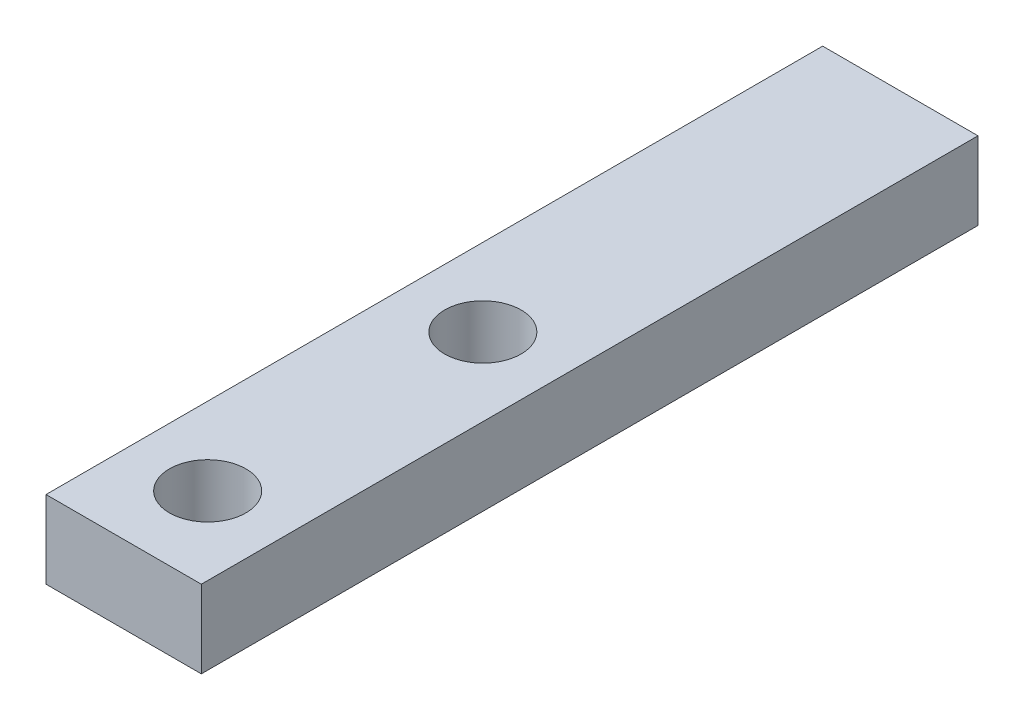
ISO-10303-21;
HEADER;
FILE_DESCRIPTION(('STEP AP214'),'2;1');
FILE_NAME('part.step','',(''),(''),'','','');
FILE_SCHEMA(('AUTOMOTIVE_DESIGN { 1 0 10303 214 1 1 1 1 }'));
ENDSEC;
DATA;
#1=APPLICATION_CONTEXT('core data for automotive mechanical design processes');
#2=APPLICATION_PROTOCOL_DEFINITION('international standard','automotive_design',2000,#1);
#3=PRODUCT_CONTEXT('',#1,'mechanical');
#4=PRODUCT('Part','Part','',(#3));
#5=PRODUCT_RELATED_PRODUCT_CATEGORY('part','',(#4));
#6=PRODUCT_DEFINITION_FORMATION('','',#4);
#7=PRODUCT_DEFINITION_CONTEXT('part definition',#1,'design');
#8=PRODUCT_DEFINITION('design','',#6,#7);
#9=PRODUCT_DEFINITION_SHAPE('','',#8);
#10=(LENGTH_UNIT() NAMED_UNIT(*) SI_UNIT(.MILLI.,.METRE.));
#11=(NAMED_UNIT(*) PLANE_ANGLE_UNIT() SI_UNIT($,.RADIAN.));
#12=(NAMED_UNIT(*) SI_UNIT($,.STERADIAN.) SOLID_ANGLE_UNIT());
#13=UNCERTAINTY_MEASURE_WITH_UNIT(LENGTH_MEASURE(1.E-05),#10,'distance_accuracy_value','');
#14=(GEOMETRIC_REPRESENTATION_CONTEXT(3) GLOBAL_UNCERTAINTY_ASSIGNED_CONTEXT((#13)) GLOBAL_UNIT_ASSIGNED_CONTEXT((#10,
#11,#12)) REPRESENTATION_CONTEXT('',''));
#15=CARTESIAN_POINT('',(0.,0.,0.));
#16=DIRECTION('',(0.,0.,1.));
#17=DIRECTION('',(1.,0.,0.));
#18=AXIS2_PLACEMENT_3D('',#15,#16,#17);
#19=CARTESIAN_POINT('',(0.,2.54,0.));
#20=DIRECTION('',(0.,-1.,0.));
#21=DIRECTION('',(0.,0.,-1.));
#22=AXIS2_PLACEMENT_3D('',#19,#20,#21);
#23=PLANE('',#22);
#24=DIRECTION('',(0.,0.,1.));
#25=VECTOR('',#24,1.);
#26=CARTESIAN_POINT('',(0.,2.54,0.));
#27=LINE('',#26,#25);
#28=CARTESIAN_POINT('',(0.,2.54,-25.4));
#29=VERTEX_POINT('',#28);
#30=CARTESIAN_POINT('',(0.,2.54,0.));
#31=VERTEX_POINT('',#30);
#32=EDGE_CURVE('E96',#29,#31,#27,.T.);
#33=ORIENTED_EDGE('',*,*,#32,.T.);
#34=DIRECTION('',(1.,0.,0.));
#35=VECTOR('',#34,1.);
#36=CARTESIAN_POINT('',(0.,2.54,0.));
#37=LINE('',#36,#35);
#38=CARTESIAN_POINT('',(5.08,2.54,0.));
#39=VERTEX_POINT('',#38);
#40=EDGE_CURVE('E91',#31,#39,#37,.T.);
#41=ORIENTED_EDGE('',*,*,#40,.T.);
#42=DIRECTION('',(0.,0.,-1.));
#43=VECTOR('',#42,1.);
#44=CARTESIAN_POINT('',(5.08,2.54,0.));
#45=LINE('',#44,#43);
#46=CARTESIAN_POINT('',(5.08,2.54,-25.4));
#47=VERTEX_POINT('',#46);
#48=EDGE_CURVE('E94',#39,#47,#45,.T.);
#49=ORIENTED_EDGE('',*,*,#48,.T.);
#50=DIRECTION('',(-1.,0.,0.));
#51=VECTOR('',#50,1.);
#52=CARTESIAN_POINT('',(0.,2.54,-25.4));
#53=LINE('',#52,#51);
#54=EDGE_CURVE('E61',#47,#29,#53,.T.);
#55=ORIENTED_EDGE('',*,*,#54,.T.);
#56=EDGE_LOOP('',(#33,#41,#49,#55));
#57=FACE_BOUND('',#56,.T.);
#58=CARTESIAN_POINT('',(2.54,2.54,-2.74720323754495));
#59=DIRECTION('',(0.,1.,0.));
#60=DIRECTION('',(0.,0.,1.));
#61=AXIS2_PLACEMENT_3D('',#58,#59,#60);
#62=CIRCLE('',#61,1.25);
#63=CARTESIAN_POINT('',(2.54,2.54,-1.49720323754495));
#64=VERTEX_POINT('',#63);
#65=EDGE_CURVE('E116',#64,#64,#62,.T.);
#66=ORIENTED_EDGE('',*,*,#65,.F.);
#67=EDGE_LOOP('',(#66));
#68=FACE_BOUND('',#67,.T.);
#69=CARTESIAN_POINT('',(2.54,2.54,-11.7472032375449));
#70=DIRECTION('',(0.,1.,0.));
#71=DIRECTION('',(0.,0.,1.));
#72=AXIS2_PLACEMENT_3D('',#69,#70,#71);
#73=CIRCLE('',#72,1.25);
#74=CARTESIAN_POINT('',(2.54,2.54,-10.4972032375449));
#75=VERTEX_POINT('',#74);
#76=EDGE_CURVE('E138',#75,#75,#73,.T.);
#77=ORIENTED_EDGE('',*,*,#76,.F.);
#78=EDGE_LOOP('',(#77));
#79=FACE_BOUND('',#78,.T.);
#80=ADVANCED_FACE('F43',(#57,#68,#79),#23,.F.);
#81=CARTESIAN_POINT('',(0.,0.,0.));
#82=DIRECTION('',(0.,-1.,0.));
#83=DIRECTION('',(0.,0.,-1.));
#84=AXIS2_PLACEMENT_3D('',#81,#82,#83);
#85=PLANE('',#84);
#86=CARTESIAN_POINT('',(2.54,0.,-2.74720323754495));
#87=DIRECTION('',(0.,1.,0.));
#88=DIRECTION('',(0.,0.,1.));
#89=AXIS2_PLACEMENT_3D('',#86,#87,#88);
#90=CIRCLE('',#89,1.25);
#91=CARTESIAN_POINT('',(2.54,0.,-1.49720323754495));
#92=VERTEX_POINT('',#91);
#93=EDGE_CURVE('E134',#92,#92,#90,.T.);
#94=ORIENTED_EDGE('',*,*,#93,.T.);
#95=EDGE_LOOP('',(#94));
#96=FACE_BOUND('',#95,.T.);
#97=DIRECTION('',(0.,0.,1.));
#98=VECTOR('',#97,1.);
#99=CARTESIAN_POINT('',(0.,0.,0.));
#100=LINE('',#99,#98);
#101=CARTESIAN_POINT('',(0.,0.,-25.4));
#102=VERTEX_POINT('',#101);
#103=CARTESIAN_POINT('',(0.,0.,0.));
#104=VERTEX_POINT('',#103);
#105=EDGE_CURVE('E112',#102,#104,#100,.T.);
#106=ORIENTED_EDGE('',*,*,#105,.F.);
#107=DIRECTION('',(-1.,0.,0.));
#108=VECTOR('',#107,1.);
#109=CARTESIAN_POINT('',(0.,0.,-25.4));
#110=LINE('',#109,#108);
#111=CARTESIAN_POINT('',(5.08,0.,-25.4));
#112=VERTEX_POINT('',#111);
#113=EDGE_CURVE('E84',#112,#102,#110,.T.);
#114=ORIENTED_EDGE('',*,*,#113,.F.);
#115=DIRECTION('',(0.,0.,-1.));
#116=VECTOR('',#115,1.);
#117=CARTESIAN_POINT('',(5.08,0.,0.));
#118=LINE('',#117,#116);
#119=CARTESIAN_POINT('',(5.08,0.,0.));
#120=VERTEX_POINT('',#119);
#121=EDGE_CURVE('E78',#120,#112,#118,.T.);
#122=ORIENTED_EDGE('',*,*,#121,.F.);
#123=DIRECTION('',(1.,0.,0.));
#124=VECTOR('',#123,1.);
#125=CARTESIAN_POINT('',(0.,0.,0.));
#126=LINE('',#125,#124);
#127=EDGE_CURVE('E101',#104,#120,#126,.T.);
#128=ORIENTED_EDGE('',*,*,#127,.F.);
#129=EDGE_LOOP('',(#106,#114,#122,#128));
#130=FACE_BOUND('',#129,.T.);
#131=CARTESIAN_POINT('',(2.54,0.,-11.7472032375449));
#132=DIRECTION('',(0.,1.,0.));
#133=DIRECTION('',(0.,0.,1.));
#134=AXIS2_PLACEMENT_3D('',#131,#132,#133);
#135=CIRCLE('',#134,1.25);
#136=CARTESIAN_POINT('',(2.54,0.,-10.4972032375449));
#137=VERTEX_POINT('',#136);
#138=EDGE_CURVE('E142',#137,#137,#135,.T.);
#139=ORIENTED_EDGE('',*,*,#138,.T.);
#140=EDGE_LOOP('',(#139));
#141=FACE_BOUND('',#140,.T.);
#142=ADVANCED_FACE('F129',(#96,#130,#141),#85,.T.);
#143=CARTESIAN_POINT('',(0.,2.54,0.));
#144=DIRECTION('',(1.,0.,0.));
#145=DIRECTION('',(0.,0.,-1.));
#146=AXIS2_PLACEMENT_3D('',#143,#144,#145);
#147=PLANE('',#146);
#148=ORIENTED_EDGE('',*,*,#105,.T.);
#149=DIRECTION('',(0.,-1.,0.));
#150=VECTOR('',#149,1.);
#151=CARTESIAN_POINT('',(0.,2.54,0.));
#152=LINE('',#151,#150);
#153=EDGE_CURVE('E11',#31,#104,#152,.T.);
#154=ORIENTED_EDGE('',*,*,#153,.F.);
#155=ORIENTED_EDGE('',*,*,#32,.F.);
#156=DIRECTION('',(0.,-1.,0.));
#157=VECTOR('',#156,1.);
#158=CARTESIAN_POINT('',(0.,2.54,-25.4));
#159=LINE('',#158,#157);
#160=EDGE_CURVE('E108',#29,#102,#159,.T.);
#161=ORIENTED_EDGE('',*,*,#160,.T.);
#162=EDGE_LOOP('',(#148,#154,#155,#161));
#163=FACE_BOUND('',#162,.T.);
#164=ADVANCED_FACE('F45',(#163),#147,.F.);
#165=CARTESIAN_POINT('',(0.,2.54,0.));
#166=DIRECTION('',(0.,0.,-1.));
#167=DIRECTION('',(-1.,0.,0.));
#168=AXIS2_PLACEMENT_3D('',#165,#166,#167);
#169=PLANE('',#168);
#170=ORIENTED_EDGE('',*,*,#127,.T.);
#171=DIRECTION('',(0.,-1.,0.));
#172=VECTOR('',#171,1.);
#173=CARTESIAN_POINT('',(5.08,2.54,0.));
#174=LINE('',#173,#172);
#175=EDGE_CURVE('E53',#39,#120,#174,.T.);
#176=ORIENTED_EDGE('',*,*,#175,.F.);
#177=ORIENTED_EDGE('',*,*,#40,.F.);
#178=ORIENTED_EDGE('',*,*,#153,.T.);
#179=EDGE_LOOP('',(#170,#176,#177,#178));
#180=FACE_BOUND('',#179,.T.);
#181=ADVANCED_FACE('F100',(#180),#169,.F.);
#182=CARTESIAN_POINT('',(5.08,2.54,0.));
#183=DIRECTION('',(-1.,0.,0.));
#184=DIRECTION('',(0.,0.,1.));
#185=AXIS2_PLACEMENT_3D('',#182,#183,#184);
#186=PLANE('',#185);
#187=ORIENTED_EDGE('',*,*,#121,.T.);
#188=DIRECTION('',(0.,-1.,0.));
#189=VECTOR('',#188,1.);
#190=CARTESIAN_POINT('',(5.08,2.54,-25.4));
#191=LINE('',#190,#189);
#192=EDGE_CURVE('E103',#47,#112,#191,.T.);
#193=ORIENTED_EDGE('',*,*,#192,.F.);
#194=ORIENTED_EDGE('',*,*,#48,.F.);
#195=ORIENTED_EDGE('',*,*,#175,.T.);
#196=EDGE_LOOP('',(#187,#193,#194,#195));
#197=FACE_BOUND('',#196,.T.);
#198=ADVANCED_FACE('F104',(#197),#186,.F.);
#199=CARTESIAN_POINT('',(0.,2.54,-25.4));
#200=DIRECTION('',(0.,0.,1.));
#201=DIRECTION('',(1.,0.,0.));
#202=AXIS2_PLACEMENT_3D('',#199,#200,#201);
#203=PLANE('',#202);
#204=ORIENTED_EDGE('',*,*,#113,.T.);
#205=ORIENTED_EDGE('',*,*,#160,.F.);
#206=ORIENTED_EDGE('',*,*,#54,.F.);
#207=ORIENTED_EDGE('',*,*,#192,.T.);
#208=EDGE_LOOP('',(#204,#205,#206,#207));
#209=FACE_BOUND('',#208,.T.);
#210=ADVANCED_FACE('F126',(#209),#203,.F.);
#211=CARTESIAN_POINT('',(2.54,2.54,-2.74720323754495));
#212=DIRECTION('',(0.,-1.,0.));
#213=DIRECTION('',(0.,0.,-1.));
#214=AXIS2_PLACEMENT_3D('',#211,#212,#213);
#215=CYLINDRICAL_SURFACE('',#214,1.25);
#216=ORIENTED_EDGE('',*,*,#65,.T.);
#217=EDGE_LOOP('',(#216));
#218=FACE_BOUND('',#217,.T.);
#219=ORIENTED_EDGE('',*,*,#93,.F.);
#220=EDGE_LOOP('',(#219));
#221=FACE_BOUND('',#220,.T.);
#222=ADVANCED_FACE('F161',(#218,#221),#215,.F.);
#223=CARTESIAN_POINT('',(2.54,2.54,-11.7472032375449));
#224=DIRECTION('',(0.,-1.,0.));
#225=DIRECTION('',(0.,0.,-1.));
#226=AXIS2_PLACEMENT_3D('',#223,#224,#225);
#227=CYLINDRICAL_SURFACE('',#226,1.25);
#228=ORIENTED_EDGE('',*,*,#76,.T.);
#229=EDGE_LOOP('',(#228));
#230=FACE_BOUND('',#229,.T.);
#231=ORIENTED_EDGE('',*,*,#138,.F.);
#232=EDGE_LOOP('',(#231));
#233=FACE_BOUND('',#232,.T.);
#234=ADVANCED_FACE('F150',(#230,#233),#227,.F.);
#235=CLOSED_SHELL('',(#80,#142,#164,#181,#198,#210,#222,#234));
#236=MANIFOLD_SOLID_BREP('B2',#235);
#237=ADVANCED_BREP_SHAPE_REPRESENTATION('',(#18,#236),#14);
#238=SHAPE_DEFINITION_REPRESENTATION(#9,#237);
ENDSEC;
END-ISO-10303-21;
